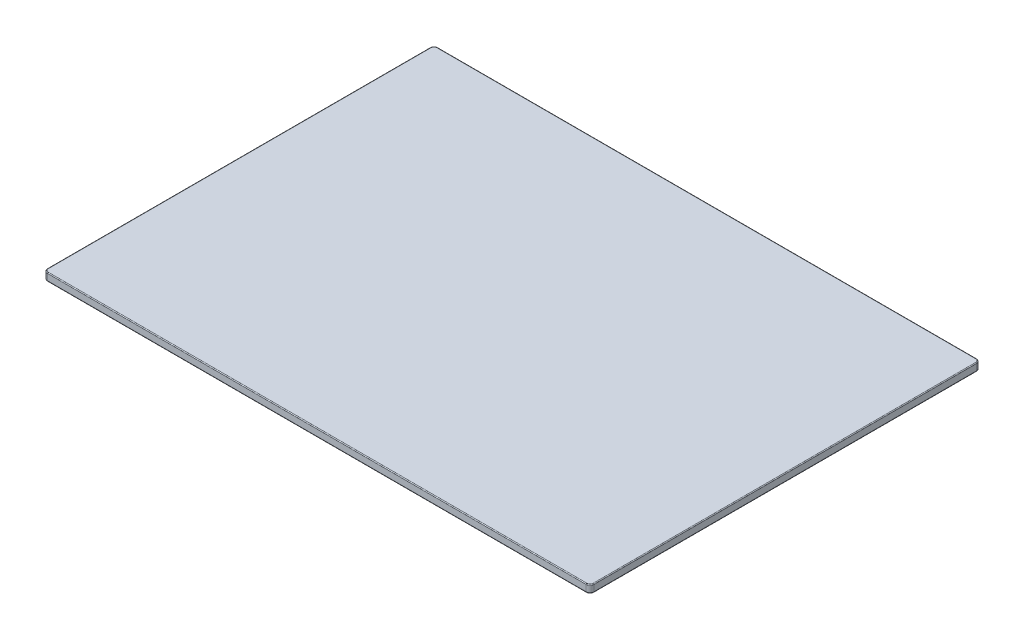
ISO-10303-21;
HEADER;
FILE_DESCRIPTION(('STEP AP214'),'2;1');
FILE_NAME('part.step','',(''),(''),'','','');
FILE_SCHEMA(('AUTOMOTIVE_DESIGN { 1 0 10303 214 1 1 1 1 }'));
ENDSEC;
DATA;
#1=APPLICATION_CONTEXT('core data for automotive mechanical design processes');
#2=APPLICATION_PROTOCOL_DEFINITION('international standard','automotive_design',2000,#1);
#3=PRODUCT_CONTEXT('',#1,'mechanical');
#4=PRODUCT('Part','Part','',(#3));
#5=PRODUCT_RELATED_PRODUCT_CATEGORY('part','',(#4));
#6=PRODUCT_DEFINITION_FORMATION('','',#4);
#7=PRODUCT_DEFINITION_CONTEXT('part definition',#1,'design');
#8=PRODUCT_DEFINITION('design','',#6,#7);
#9=PRODUCT_DEFINITION_SHAPE('','',#8);
#10=(LENGTH_UNIT() NAMED_UNIT(*) SI_UNIT(.MILLI.,.METRE.));
#11=(NAMED_UNIT(*) PLANE_ANGLE_UNIT() SI_UNIT($,.RADIAN.));
#12=(NAMED_UNIT(*) SI_UNIT($,.STERADIAN.) SOLID_ANGLE_UNIT());
#13=UNCERTAINTY_MEASURE_WITH_UNIT(LENGTH_MEASURE(1.E-05),#10,'distance_accuracy_value','');
#14=(GEOMETRIC_REPRESENTATION_CONTEXT(3) GLOBAL_UNCERTAINTY_ASSIGNED_CONTEXT((#13)) GLOBAL_UNIT_ASSIGNED_CONTEXT((#10,
#11,#12)) REPRESENTATION_CONTEXT('',''));
#15=CARTESIAN_POINT('',(0.,0.,0.));
#16=DIRECTION('',(0.,0.,1.));
#17=DIRECTION('',(1.,0.,0.));
#18=AXIS2_PLACEMENT_3D('',#15,#16,#17);
#19=CARTESIAN_POINT('',(350.,10.,250.));
#20=DIRECTION('',(-1.,0.,0.));
#21=DIRECTION('',(0.,0.,1.));
#22=AXIS2_PLACEMENT_3D('',#19,#20,#21);
#23=PLANE('',#22);
#24=DIRECTION('',(0.,-1.,0.));
#25=VECTOR('',#24,1.);
#26=CARTESIAN_POINT('',(350.,10.,245.));
#27=LINE('',#26,#25);
#28=CARTESIAN_POINT('',(350.,9.,245.));
#29=VERTEX_POINT('',#28);
#30=CARTESIAN_POINT('',(350.,0.999999999999999,245.));
#31=VERTEX_POINT('',#30);
#32=EDGE_CURVE('E299',#29,#31,#27,.T.);
#33=ORIENTED_EDGE('',*,*,#32,.T.);
#34=DIRECTION('',(0.,0.,-1.));
#35=VECTOR('',#34,1.);
#36=CARTESIAN_POINT('',(350.,0.999999999999999,-245.));
#37=LINE('',#36,#35);
#38=CARTESIAN_POINT('',(350.,0.999999999999999,-245.));
#39=VERTEX_POINT('',#38);
#40=EDGE_CURVE('E198',#31,#39,#37,.T.);
#41=ORIENTED_EDGE('',*,*,#40,.T.);
#42=DIRECTION('',(0.,-1.,0.));
#43=VECTOR('',#42,1.);
#44=CARTESIAN_POINT('',(350.,10.,-245.));
#45=LINE('',#44,#43);
#46=CARTESIAN_POINT('',(350.,9.,-245.));
#47=VERTEX_POINT('',#46);
#48=EDGE_CURVE('E302',#39,#47,#45,.F.);
#49=ORIENTED_EDGE('',*,*,#48,.T.);
#50=DIRECTION('',(0.,0.,-1.));
#51=VECTOR('',#50,1.);
#52=CARTESIAN_POINT('',(350.,9.,250.));
#53=LINE('',#52,#51);
#54=EDGE_CURVE('E196',#47,#29,#53,.F.);
#55=ORIENTED_EDGE('',*,*,#54,.T.);
#56=EDGE_LOOP('',(#33,#41,#49,#55));
#57=FACE_BOUND('',#56,.T.);
#58=ADVANCED_FACE('F41',(#57),#23,.F.);
#59=CARTESIAN_POINT('',(-350.,10.,-250.));
#60=DIRECTION('',(0.,0.,1.));
#61=DIRECTION('',(1.,0.,0.));
#62=AXIS2_PLACEMENT_3D('',#59,#60,#61);
#63=PLANE('',#62);
#64=DIRECTION('',(0.,-1.,0.));
#65=VECTOR('',#64,1.);
#66=CARTESIAN_POINT('',(345.,10.,-250.));
#67=LINE('',#66,#65);
#68=CARTESIAN_POINT('',(345.,9.,-250.));
#69=VERTEX_POINT('',#68);
#70=CARTESIAN_POINT('',(345.,0.999999999999999,-250.));
#71=VERTEX_POINT('',#70);
#72=EDGE_CURVE('E291',#69,#71,#67,.T.);
#73=ORIENTED_EDGE('',*,*,#72,.T.);
#74=DIRECTION('',(-1.,0.,0.));
#75=VECTOR('',#74,1.);
#76=CARTESIAN_POINT('',(-345.,0.999999999999999,-250.));
#77=LINE('',#76,#75);
#78=CARTESIAN_POINT('',(-345.,0.999999999999999,-250.));
#79=VERTEX_POINT('',#78);
#80=EDGE_CURVE('E207',#71,#79,#77,.T.);
#81=ORIENTED_EDGE('',*,*,#80,.T.);
#82=DIRECTION('',(0.,-1.,0.));
#83=VECTOR('',#82,1.);
#84=CARTESIAN_POINT('',(-345.,10.,-250.));
#85=LINE('',#84,#83);
#86=CARTESIAN_POINT('',(-345.,9.,-250.));
#87=VERTEX_POINT('',#86);
#88=EDGE_CURVE('E296',#79,#87,#85,.F.);
#89=ORIENTED_EDGE('',*,*,#88,.T.);
#90=DIRECTION('',(-1.,0.,0.));
#91=VECTOR('',#90,1.);
#92=CARTESIAN_POINT('',(-350.,9.,-250.));
#93=LINE('',#92,#91);
#94=EDGE_CURVE('E205',#87,#69,#93,.F.);
#95=ORIENTED_EDGE('',*,*,#94,.T.);
#96=EDGE_LOOP('',(#73,#81,#89,#95));
#97=FACE_BOUND('',#96,.T.);
#98=ADVANCED_FACE('F354',(#97),#63,.F.);
#99=CARTESIAN_POINT('',(-350.,10.,250.));
#100=DIRECTION('',(1.,0.,0.));
#101=DIRECTION('',(0.,0.,-1.));
#102=AXIS2_PLACEMENT_3D('',#99,#100,#101);
#103=PLANE('',#102);
#104=DIRECTION('',(0.,-1.,0.));
#105=VECTOR('',#104,1.);
#106=CARTESIAN_POINT('',(-350.,10.,-245.));
#107=LINE('',#106,#105);
#108=CARTESIAN_POINT('',(-350.,9.,-245.));
#109=VERTEX_POINT('',#108);
#110=CARTESIAN_POINT('',(-350.,0.999999999999999,-245.));
#111=VERTEX_POINT('',#110);
#112=EDGE_CURVE('E289',#109,#111,#107,.T.);
#113=ORIENTED_EDGE('',*,*,#112,.T.);
#114=DIRECTION('',(0.,0.,1.));
#115=VECTOR('',#114,1.);
#116=CARTESIAN_POINT('',(-350.,0.999999999999999,245.));
#117=LINE('',#116,#115);
#118=CARTESIAN_POINT('',(-350.,0.999999999999999,245.));
#119=VERTEX_POINT('',#118);
#120=EDGE_CURVE('E215',#111,#119,#117,.T.);
#121=ORIENTED_EDGE('',*,*,#120,.T.);
#122=DIRECTION('',(0.,-1.,0.));
#123=VECTOR('',#122,1.);
#124=CARTESIAN_POINT('',(-350.,10.,245.));
#125=LINE('',#124,#123);
#126=CARTESIAN_POINT('',(-350.,9.,245.));
#127=VERTEX_POINT('',#126);
#128=EDGE_CURVE('E246',#119,#127,#125,.F.);
#129=ORIENTED_EDGE('',*,*,#128,.T.);
#130=DIRECTION('',(0.,0.,1.));
#131=VECTOR('',#130,1.);
#132=CARTESIAN_POINT('',(-350.,9.,250.));
#133=LINE('',#132,#131);
#134=EDGE_CURVE('E213',#127,#109,#133,.F.);
#135=ORIENTED_EDGE('',*,*,#134,.T.);
#136=EDGE_LOOP('',(#113,#121,#129,#135));
#137=FACE_BOUND('',#136,.T.);
#138=ADVANCED_FACE('F287',(#137),#103,.F.);
#139=CARTESIAN_POINT('',(-350.,10.,250.));
#140=DIRECTION('',(0.,0.,-1.));
#141=DIRECTION('',(-1.,0.,0.));
#142=AXIS2_PLACEMENT_3D('',#139,#140,#141);
#143=PLANE('',#142);
#144=DIRECTION('',(0.,-1.,0.));
#145=VECTOR('',#144,1.);
#146=CARTESIAN_POINT('',(-345.,10.,250.));
#147=LINE('',#146,#145);
#148=CARTESIAN_POINT('',(-345.,9.,250.));
#149=VERTEX_POINT('',#148);
#150=CARTESIAN_POINT('',(-345.,0.999999999999999,250.));
#151=VERTEX_POINT('',#150);
#152=EDGE_CURVE('E284',#149,#151,#147,.T.);
#153=ORIENTED_EDGE('',*,*,#152,.T.);
#154=DIRECTION('',(1.,0.,0.));
#155=VECTOR('',#154,1.);
#156=CARTESIAN_POINT('',(345.,0.999999999999999,250.));
#157=LINE('',#156,#155);
#158=CARTESIAN_POINT('',(345.,0.999999999999999,250.));
#159=VERTEX_POINT('',#158);
#160=EDGE_CURVE('E190',#151,#159,#157,.T.);
#161=ORIENTED_EDGE('',*,*,#160,.T.);
#162=DIRECTION('',(0.,-1.,0.));
#163=VECTOR('',#162,1.);
#164=CARTESIAN_POINT('',(345.,10.,250.));
#165=LINE('',#164,#163);
#166=CARTESIAN_POINT('',(345.,9.,250.));
#167=VERTEX_POINT('',#166);
#168=EDGE_CURVE('E174',#159,#167,#165,.F.);
#169=ORIENTED_EDGE('',*,*,#168,.T.);
#170=DIRECTION('',(1.,0.,0.));
#171=VECTOR('',#170,1.);
#172=CARTESIAN_POINT('',(-350.,9.,250.));
#173=LINE('',#172,#171);
#174=EDGE_CURVE('E188',#167,#149,#173,.F.);
#175=ORIENTED_EDGE('',*,*,#174,.T.);
#176=EDGE_LOOP('',(#153,#161,#169,#175));
#177=FACE_BOUND('',#176,.T.);
#178=ADVANCED_FACE('F326',(#177),#143,.F.);
#179=CARTESIAN_POINT('',(0.,10.,0.));
#180=DIRECTION('',(0.,-1.,0.));
#181=DIRECTION('',(0.,0.,-1.));
#182=AXIS2_PLACEMENT_3D('',#179,#180,#181);
#183=PLANE('',#182);
#184=DIRECTION('',(0.,0.,-1.));
#185=VECTOR('',#184,1.);
#186=CARTESIAN_POINT('',(349.,10.,0.));
#187=LINE('',#186,#185);
#188=CARTESIAN_POINT('',(349.,10.,245.));
#189=VERTEX_POINT('',#188);
#190=CARTESIAN_POINT('',(349.,10.,-245.));
#191=VERTEX_POINT('',#190);
#192=EDGE_CURVE('E50',#189,#191,#187,.T.);
#193=ORIENTED_EDGE('',*,*,#192,.T.);
#194=CARTESIAN_POINT('',(345.,10.,-245.));
#195=DIRECTION('',(0.,-1.,0.));
#196=DIRECTION('',(0.,0.,-1.));
#197=AXIS2_PLACEMENT_3D('',#194,#195,#196);
#198=CIRCLE('',#197,4.);
#199=CARTESIAN_POINT('',(345.,10.,-249.));
#200=VERTEX_POINT('',#199);
#201=EDGE_CURVE('E11',#191,#200,#198,.F.);
#202=ORIENTED_EDGE('',*,*,#201,.T.);
#203=DIRECTION('',(-1.,0.,0.));
#204=VECTOR('',#203,1.);
#205=CARTESIAN_POINT('',(0.,10.,-249.));
#206=LINE('',#205,#204);
#207=CARTESIAN_POINT('',(-345.,10.,-249.));
#208=VERTEX_POINT('',#207);
#209=EDGE_CURVE('E217',#200,#208,#206,.T.);
#210=ORIENTED_EDGE('',*,*,#209,.T.);
#211=CARTESIAN_POINT('',(-345.,10.,-245.));
#212=DIRECTION('',(0.,-1.,0.));
#213=DIRECTION('',(0.,0.,-1.));
#214=AXIS2_PLACEMENT_3D('',#211,#212,#213);
#215=CIRCLE('',#214,4.);
#216=CARTESIAN_POINT('',(-349.,10.,-245.));
#217=VERTEX_POINT('',#216);
#218=EDGE_CURVE('E219',#208,#217,#215,.F.);
#219=ORIENTED_EDGE('',*,*,#218,.T.);
#220=DIRECTION('',(0.,0.,1.));
#221=VECTOR('',#220,1.);
#222=CARTESIAN_POINT('',(-349.,10.,0.));
#223=LINE('',#222,#221);
#224=CARTESIAN_POINT('',(-349.,10.,245.));
#225=VERTEX_POINT('',#224);
#226=EDGE_CURVE('E221',#217,#225,#223,.T.);
#227=ORIENTED_EDGE('',*,*,#226,.T.);
#228=CARTESIAN_POINT('',(-345.,10.,245.));
#229=DIRECTION('',(0.,-1.,0.));
#230=DIRECTION('',(0.,0.,-1.));
#231=AXIS2_PLACEMENT_3D('',#228,#229,#230);
#232=CIRCLE('',#231,4.);
#233=CARTESIAN_POINT('',(-345.,10.,249.));
#234=VERTEX_POINT('',#233);
#235=EDGE_CURVE('E223',#225,#234,#232,.F.);
#236=ORIENTED_EDGE('',*,*,#235,.T.);
#237=DIRECTION('',(1.,0.,0.));
#238=VECTOR('',#237,1.);
#239=CARTESIAN_POINT('',(0.,10.,249.));
#240=LINE('',#239,#238);
#241=CARTESIAN_POINT('',(345.,10.,249.));
#242=VERTEX_POINT('',#241);
#243=EDGE_CURVE('E225',#234,#242,#240,.T.);
#244=ORIENTED_EDGE('',*,*,#243,.T.);
#245=CARTESIAN_POINT('',(345.,10.,245.));
#246=DIRECTION('',(0.,-1.,0.));
#247=DIRECTION('',(0.,0.,-1.));
#248=AXIS2_PLACEMENT_3D('',#245,#246,#247);
#249=CIRCLE('',#248,4.);
#250=EDGE_CURVE('E61',#242,#189,#249,.F.);
#251=ORIENTED_EDGE('',*,*,#250,.T.);
#252=EDGE_LOOP('',(#193,#202,#210,#219,#227,#236,#244,#251));
#253=FACE_BOUND('',#252,.T.);
#254=ADVANCED_FACE('F342',(#253),#183,.F.);
#255=CARTESIAN_POINT('',(0.,0.,0.));
#256=DIRECTION('',(0.,-1.,0.));
#257=DIRECTION('',(0.,0.,-1.));
#258=AXIS2_PLACEMENT_3D('',#255,#256,#257);
#259=PLANE('',#258);
#260=DIRECTION('',(1.,0.,0.));
#261=VECTOR('',#260,1.);
#262=CARTESIAN_POINT('',(-345.,0.,249.));
#263=LINE('',#262,#261);
#264=CARTESIAN_POINT('',(345.,0.,249.));
#265=VERTEX_POINT('',#264);
#266=CARTESIAN_POINT('',(-345.,0.,249.));
#267=VERTEX_POINT('',#266);
#268=EDGE_CURVE('E178',#265,#267,#263,.F.);
#269=ORIENTED_EDGE('',*,*,#268,.T.);
#270=CARTESIAN_POINT('',(-345.,0.,245.));
#271=DIRECTION('',(0.,-1.,0.));
#272=DIRECTION('',(0.,0.,-1.));
#273=AXIS2_PLACEMENT_3D('',#270,#271,#272);
#274=CIRCLE('',#273,4.);
#275=CARTESIAN_POINT('',(-349.,0.,245.));
#276=VERTEX_POINT('',#275);
#277=EDGE_CURVE('E159',#267,#276,#274,.T.);
#278=ORIENTED_EDGE('',*,*,#277,.T.);
#279=DIRECTION('',(0.,0.,1.));
#280=VECTOR('',#279,1.);
#281=CARTESIAN_POINT('',(-349.,0.,-245.));
#282=LINE('',#281,#280);
#283=CARTESIAN_POINT('',(-349.,0.,-245.));
#284=VERTEX_POINT('',#283);
#285=EDGE_CURVE('E167',#276,#284,#282,.F.);
#286=ORIENTED_EDGE('',*,*,#285,.T.);
#287=CARTESIAN_POINT('',(-345.,0.,-245.));
#288=DIRECTION('',(0.,-1.,0.));
#289=DIRECTION('',(0.,0.,-1.));
#290=AXIS2_PLACEMENT_3D('',#287,#288,#289);
#291=CIRCLE('',#290,4.);
#292=CARTESIAN_POINT('',(-345.,0.,-249.));
#293=VERTEX_POINT('',#292);
#294=EDGE_CURVE('E173',#284,#293,#291,.T.);
#295=ORIENTED_EDGE('',*,*,#294,.T.);
#296=DIRECTION('',(-1.,0.,0.));
#297=VECTOR('',#296,1.);
#298=CARTESIAN_POINT('',(345.,0.,-249.));
#299=LINE('',#298,#297);
#300=CARTESIAN_POINT('',(345.,0.,-249.));
#301=VERTEX_POINT('',#300);
#302=EDGE_CURVE('E309',#293,#301,#299,.F.);
#303=ORIENTED_EDGE('',*,*,#302,.T.);
#304=CARTESIAN_POINT('',(345.,0.,-245.));
#305=DIRECTION('',(0.,-1.,0.));
#306=DIRECTION('',(0.,0.,-1.));
#307=AXIS2_PLACEMENT_3D('',#304,#305,#306);
#308=CIRCLE('',#307,4.);
#309=CARTESIAN_POINT('',(349.,0.,-245.));
#310=VERTEX_POINT('',#309);
#311=EDGE_CURVE('E311',#301,#310,#308,.T.);
#312=ORIENTED_EDGE('',*,*,#311,.T.);
#313=DIRECTION('',(0.,0.,-1.));
#314=VECTOR('',#313,1.);
#315=CARTESIAN_POINT('',(349.,0.,245.));
#316=LINE('',#315,#314);
#317=CARTESIAN_POINT('',(349.,0.,245.));
#318=VERTEX_POINT('',#317);
#319=EDGE_CURVE('E313',#310,#318,#316,.F.);
#320=ORIENTED_EDGE('',*,*,#319,.T.);
#321=CARTESIAN_POINT('',(345.,0.,245.));
#322=DIRECTION('',(0.,-1.,0.));
#323=DIRECTION('',(0.,0.,-1.));
#324=AXIS2_PLACEMENT_3D('',#321,#322,#323);
#325=CIRCLE('',#324,4.);
#326=EDGE_CURVE('E183',#318,#265,#325,.T.);
#327=ORIENTED_EDGE('',*,*,#326,.T.);
#328=EDGE_LOOP('',(#269,#278,#286,#295,#303,#312,#320,#327));
#329=FACE_BOUND('',#328,.T.);
#330=ADVANCED_FACE('F176',(#329),#259,.T.);
#331=CARTESIAN_POINT('',(-345.,10.,-245.));
#332=DIRECTION('',(0.,-1.,0.));
#333=DIRECTION('',(0.,0.,-1.));
#334=AXIS2_PLACEMENT_3D('',#331,#332,#333);
#335=CYLINDRICAL_SURFACE('',#334,5.);
#336=ORIENTED_EDGE('',*,*,#88,.F.);
#337=CARTESIAN_POINT('',(-345.,0.999999999999999,-245.));
#338=DIRECTION('',(0.,-1.,0.));
#339=DIRECTION('',(0.,0.,-1.));
#340=AXIS2_PLACEMENT_3D('',#337,#338,#339);
#341=CIRCLE('',#340,5.);
#342=EDGE_CURVE('E211',#79,#111,#341,.F.);
#343=ORIENTED_EDGE('',*,*,#342,.T.);
#344=ORIENTED_EDGE('',*,*,#112,.F.);
#345=CARTESIAN_POINT('',(-345.,9.,-245.));
#346=DIRECTION('',(0.,-1.,0.));
#347=DIRECTION('',(0.,0.,-1.));
#348=AXIS2_PLACEMENT_3D('',#345,#346,#347);
#349=CIRCLE('',#348,5.);
#350=EDGE_CURVE('E209',#109,#87,#349,.T.);
#351=ORIENTED_EDGE('',*,*,#350,.T.);
#352=EDGE_LOOP('',(#336,#343,#344,#351));
#353=FACE_BOUND('',#352,.T.);
#354=ADVANCED_FACE('F378',(#353),#335,.T.);
#355=CARTESIAN_POINT('',(345.,10.,-245.));
#356=DIRECTION('',(0.,-1.,0.));
#357=DIRECTION('',(0.,0.,-1.));
#358=AXIS2_PLACEMENT_3D('',#355,#356,#357);
#359=CYLINDRICAL_SURFACE('',#358,5.);
#360=ORIENTED_EDGE('',*,*,#48,.F.);
#361=CARTESIAN_POINT('',(345.,0.999999999999999,-245.));
#362=DIRECTION('',(0.,-1.,0.));
#363=DIRECTION('',(0.,0.,-1.));
#364=AXIS2_PLACEMENT_3D('',#361,#362,#363);
#365=CIRCLE('',#364,5.);
#366=EDGE_CURVE('E203',#39,#71,#365,.F.);
#367=ORIENTED_EDGE('',*,*,#366,.T.);
#368=ORIENTED_EDGE('',*,*,#72,.F.);
#369=CARTESIAN_POINT('',(345.,9.,-245.));
#370=DIRECTION('',(0.,-1.,0.));
#371=DIRECTION('',(0.,0.,-1.));
#372=AXIS2_PLACEMENT_3D('',#369,#370,#371);
#373=CIRCLE('',#372,5.);
#374=EDGE_CURVE('E200',#69,#47,#373,.T.);
#375=ORIENTED_EDGE('',*,*,#374,.T.);
#376=EDGE_LOOP('',(#360,#367,#368,#375));
#377=FACE_BOUND('',#376,.T.);
#378=ADVANCED_FACE('F359',(#377),#359,.T.);
#379=CARTESIAN_POINT('',(345.,10.,245.));
#380=DIRECTION('',(0.,-1.,0.));
#381=DIRECTION('',(0.,0.,-1.));
#382=AXIS2_PLACEMENT_3D('',#379,#380,#381);
#383=CYLINDRICAL_SURFACE('',#382,5.);
#384=ORIENTED_EDGE('',*,*,#168,.F.);
#385=CARTESIAN_POINT('',(345.,0.999999999999999,245.));
#386=DIRECTION('',(0.,-1.,0.));
#387=DIRECTION('',(0.,0.,-1.));
#388=AXIS2_PLACEMENT_3D('',#385,#386,#387);
#389=CIRCLE('',#388,5.);
#390=EDGE_CURVE('E194',#159,#31,#389,.F.);
#391=ORIENTED_EDGE('',*,*,#390,.T.);
#392=ORIENTED_EDGE('',*,*,#32,.F.);
#393=CARTESIAN_POINT('',(345.,9.,245.));
#394=DIRECTION('',(0.,-1.,0.));
#395=DIRECTION('',(0.,0.,-1.));
#396=AXIS2_PLACEMENT_3D('',#393,#394,#395);
#397=CIRCLE('',#396,5.);
#398=EDGE_CURVE('E192',#29,#167,#397,.T.);
#399=ORIENTED_EDGE('',*,*,#398,.T.);
#400=EDGE_LOOP('',(#384,#391,#392,#399));
#401=FACE_BOUND('',#400,.T.);
#402=ADVANCED_FACE('F328',(#401),#383,.T.);
#403=CARTESIAN_POINT('',(-345.,10.,245.));
#404=DIRECTION('',(0.,-1.,0.));
#405=DIRECTION('',(0.,0.,-1.));
#406=AXIS2_PLACEMENT_3D('',#403,#404,#405);
#407=CYLINDRICAL_SURFACE('',#406,5.);
#408=ORIENTED_EDGE('',*,*,#128,.F.);
#409=CARTESIAN_POINT('',(-345.,0.999999999999999,245.));
#410=DIRECTION('',(0.,-1.,0.));
#411=DIRECTION('',(0.,0.,-1.));
#412=AXIS2_PLACEMENT_3D('',#409,#410,#411);
#413=CIRCLE('',#412,5.);
#414=EDGE_CURVE('E161',#119,#151,#413,.F.);
#415=ORIENTED_EDGE('',*,*,#414,.T.);
#416=ORIENTED_EDGE('',*,*,#152,.F.);
#417=CARTESIAN_POINT('',(-345.,9.,245.));
#418=DIRECTION('',(0.,-1.,0.));
#419=DIRECTION('',(0.,0.,-1.));
#420=AXIS2_PLACEMENT_3D('',#417,#418,#419);
#421=CIRCLE('',#420,5.);
#422=EDGE_CURVE('E180',#149,#127,#421,.T.);
#423=ORIENTED_EDGE('',*,*,#422,.T.);
#424=EDGE_LOOP('',(#408,#415,#416,#423));
#425=FACE_BOUND('',#424,.T.);
#426=ADVANCED_FACE('F282',(#425),#407,.T.);
#427=CARTESIAN_POINT('',(345.,0.999999999999999,-245.));
#428=DIRECTION('',(0.,-1.,0.));
#429=DIRECTION('',(0.,0.,-1.));
#430=AXIS2_PLACEMENT_3D('',#427,#428,#429);
#431=TOROIDAL_SURFACE('',#430,4.,1.);
#432=CARTESIAN_POINT('',(345.,0.999999999999999,-249.));
#433=DIRECTION('',(-1.,0.,0.));
#434=DIRECTION('',(0.,0.,1.));
#435=AXIS2_PLACEMENT_3D('',#432,#433,#434);
#436=CIRCLE('',#435,1.);
#437=EDGE_CURVE('E240',#71,#301,#436,.T.);
#438=ORIENTED_EDGE('',*,*,#437,.F.);
#439=ORIENTED_EDGE('',*,*,#366,.F.);
#440=CARTESIAN_POINT('',(349.,1.,-245.));
#441=DIRECTION('',(0.,0.,1.));
#442=DIRECTION('',(1.,0.,0.));
#443=AXIS2_PLACEMENT_3D('',#440,#441,#442);
#444=CIRCLE('',#443,1.);
#445=EDGE_CURVE('E243',#310,#39,#444,.T.);
#446=ORIENTED_EDGE('',*,*,#445,.F.);
#447=ORIENTED_EDGE('',*,*,#311,.F.);
#448=EDGE_LOOP('',(#438,#439,#446,#447));
#449=FACE_BOUND('',#448,.T.);
#450=ADVANCED_FACE('F363',(#449),#431,.T.);
#451=CARTESIAN_POINT('',(349.,0.999999999999999,250.));
#452=DIRECTION('',(0.,0.,1.));
#453=DIRECTION('',(1.,0.,0.));
#454=AXIS2_PLACEMENT_3D('',#451,#452,#453);
#455=CYLINDRICAL_SURFACE('',#454,1.);
#456=ORIENTED_EDGE('',*,*,#445,.T.);
#457=ORIENTED_EDGE('',*,*,#40,.F.);
#458=CARTESIAN_POINT('',(349.,1.,245.));
#459=DIRECTION('',(0.,0.,1.));
#460=DIRECTION('',(1.,0.,0.));
#461=AXIS2_PLACEMENT_3D('',#458,#459,#460);
#462=CIRCLE('',#461,1.);
#463=EDGE_CURVE('E237',#318,#31,#462,.T.);
#464=ORIENTED_EDGE('',*,*,#463,.F.);
#465=ORIENTED_EDGE('',*,*,#319,.F.);
#466=EDGE_LOOP('',(#456,#457,#464,#465));
#467=FACE_BOUND('',#466,.T.);
#468=ADVANCED_FACE('F368',(#467),#455,.T.);
#469=CARTESIAN_POINT('',(-350.,0.999999999999999,-249.));
#470=DIRECTION('',(1.,0.,0.));
#471=DIRECTION('',(0.,0.,-1.));
#472=AXIS2_PLACEMENT_3D('',#469,#470,#471);
#473=CYLINDRICAL_SURFACE('',#472,1.);
#474=ORIENTED_EDGE('',*,*,#437,.T.);
#475=ORIENTED_EDGE('',*,*,#302,.F.);
#476=CARTESIAN_POINT('',(-345.,0.999999999999999,-249.));
#477=DIRECTION('',(-1.,0.,0.));
#478=DIRECTION('',(0.,0.,1.));
#479=AXIS2_PLACEMENT_3D('',#476,#477,#478);
#480=CIRCLE('',#479,1.);
#481=EDGE_CURVE('E234',#79,#293,#480,.T.);
#482=ORIENTED_EDGE('',*,*,#481,.F.);
#483=ORIENTED_EDGE('',*,*,#80,.F.);
#484=EDGE_LOOP('',(#474,#475,#482,#483));
#485=FACE_BOUND('',#484,.T.);
#486=ADVANCED_FACE('F400',(#485),#473,.T.);
#487=CARTESIAN_POINT('',(345.,0.999999999999999,245.));
#488=DIRECTION('',(0.,-1.,0.));
#489=DIRECTION('',(0.,0.,-1.));
#490=AXIS2_PLACEMENT_3D('',#487,#488,#489);
#491=TOROIDAL_SURFACE('',#490,4.,1.);
#492=ORIENTED_EDGE('',*,*,#463,.T.);
#493=ORIENTED_EDGE('',*,*,#390,.F.);
#494=CARTESIAN_POINT('',(345.,1.,249.));
#495=DIRECTION('',(-1.,0.,0.));
#496=DIRECTION('',(0.,0.,1.));
#497=AXIS2_PLACEMENT_3D('',#494,#495,#496);
#498=CIRCLE('',#497,1.);
#499=EDGE_CURVE('E231',#265,#159,#498,.T.);
#500=ORIENTED_EDGE('',*,*,#499,.F.);
#501=ORIENTED_EDGE('',*,*,#326,.F.);
#502=EDGE_LOOP('',(#492,#493,#500,#501));
#503=FACE_BOUND('',#502,.T.);
#504=ADVANCED_FACE('F320',(#503),#491,.T.);
#505=CARTESIAN_POINT('',(-345.,0.999999999999999,-245.));
#506=DIRECTION('',(0.,-1.,0.));
#507=DIRECTION('',(0.,0.,-1.));
#508=AXIS2_PLACEMENT_3D('',#505,#506,#507);
#509=TOROIDAL_SURFACE('',#508,4.,1.);
#510=ORIENTED_EDGE('',*,*,#481,.T.);
#511=ORIENTED_EDGE('',*,*,#294,.F.);
#512=CARTESIAN_POINT('',(-349.,0.999999999999999,-245.));
#513=DIRECTION('',(0.,0.,1.));
#514=DIRECTION('',(1.,0.,0.));
#515=AXIS2_PLACEMENT_3D('',#512,#513,#514);
#516=CIRCLE('',#515,1.);
#517=EDGE_CURVE('E170',#111,#284,#516,.T.);
#518=ORIENTED_EDGE('',*,*,#517,.F.);
#519=ORIENTED_EDGE('',*,*,#342,.F.);
#520=EDGE_LOOP('',(#510,#511,#518,#519));
#521=FACE_BOUND('',#520,.T.);
#522=ADVANCED_FACE('F394',(#521),#509,.T.);
#523=CARTESIAN_POINT('',(-350.,0.999999999999999,249.));
#524=DIRECTION('',(-1.,0.,0.));
#525=DIRECTION('',(0.,0.,1.));
#526=AXIS2_PLACEMENT_3D('',#523,#524,#525);
#527=CYLINDRICAL_SURFACE('',#526,1.);
#528=ORIENTED_EDGE('',*,*,#499,.T.);
#529=ORIENTED_EDGE('',*,*,#160,.F.);
#530=CARTESIAN_POINT('',(-345.,1.,249.));
#531=DIRECTION('',(-1.,0.,0.));
#532=DIRECTION('',(0.,0.,1.));
#533=AXIS2_PLACEMENT_3D('',#530,#531,#532);
#534=CIRCLE('',#533,1.);
#535=EDGE_CURVE('E164',#267,#151,#534,.T.);
#536=ORIENTED_EDGE('',*,*,#535,.F.);
#537=ORIENTED_EDGE('',*,*,#268,.F.);
#538=EDGE_LOOP('',(#528,#529,#536,#537));
#539=FACE_BOUND('',#538,.T.);
#540=ADVANCED_FACE('F323',(#539),#527,.T.);
#541=CARTESIAN_POINT('',(-349.,0.999999999999999,250.));
#542=DIRECTION('',(0.,0.,-1.));
#543=DIRECTION('',(-1.,0.,0.));
#544=AXIS2_PLACEMENT_3D('',#541,#542,#543);
#545=CYLINDRICAL_SURFACE('',#544,1.);
#546=ORIENTED_EDGE('',*,*,#517,.T.);
#547=ORIENTED_EDGE('',*,*,#285,.F.);
#548=CARTESIAN_POINT('',(-349.,0.999999999999999,245.));
#549=DIRECTION('',(0.,0.,1.));
#550=DIRECTION('',(1.,0.,0.));
#551=AXIS2_PLACEMENT_3D('',#548,#549,#550);
#552=CIRCLE('',#551,1.);
#553=EDGE_CURVE('E155',#119,#276,#552,.T.);
#554=ORIENTED_EDGE('',*,*,#553,.F.);
#555=ORIENTED_EDGE('',*,*,#120,.F.);
#556=EDGE_LOOP('',(#546,#547,#554,#555));
#557=FACE_BOUND('',#556,.T.);
#558=ADVANCED_FACE('F168',(#557),#545,.T.);
#559=CARTESIAN_POINT('',(-345.,0.999999999999999,245.));
#560=DIRECTION('',(0.,-1.,0.));
#561=DIRECTION('',(0.,0.,-1.));
#562=AXIS2_PLACEMENT_3D('',#559,#560,#561);
#563=TOROIDAL_SURFACE('',#562,4.,1.);
#564=ORIENTED_EDGE('',*,*,#535,.T.);
#565=ORIENTED_EDGE('',*,*,#414,.F.);
#566=ORIENTED_EDGE('',*,*,#553,.T.);
#567=ORIENTED_EDGE('',*,*,#277,.F.);
#568=EDGE_LOOP('',(#564,#565,#566,#567));
#569=FACE_BOUND('',#568,.T.);
#570=ADVANCED_FACE('F157',(#569),#563,.T.);
#571=CARTESIAN_POINT('',(-345.,9.,245.));
#572=DIRECTION('',(0.,-1.,0.));
#573=DIRECTION('',(0.,0.,-1.));
#574=AXIS2_PLACEMENT_3D('',#571,#572,#573);
#575=TOROIDAL_SURFACE('',#574,4.,1.);
#576=CARTESIAN_POINT('',(-349.,9.,245.));
#577=DIRECTION('',(0.,0.,-1.));
#578=DIRECTION('',(-1.,0.,0.));
#579=AXIS2_PLACEMENT_3D('',#576,#577,#578);
#580=CIRCLE('',#579,1.);
#581=EDGE_CURVE('E262',#127,#225,#580,.T.);
#582=ORIENTED_EDGE('',*,*,#581,.F.);
#583=ORIENTED_EDGE('',*,*,#422,.F.);
#584=CARTESIAN_POINT('',(-345.,9.,249.));
#585=DIRECTION('',(1.,0.,0.));
#586=DIRECTION('',(0.,0.,-1.));
#587=AXIS2_PLACEMENT_3D('',#584,#585,#586);
#588=CIRCLE('',#587,1.);
#589=EDGE_CURVE('E45',#234,#149,#588,.T.);
#590=ORIENTED_EDGE('',*,*,#589,.F.);
#591=ORIENTED_EDGE('',*,*,#235,.F.);
#592=EDGE_LOOP('',(#582,#583,#590,#591));
#593=FACE_BOUND('',#592,.T.);
#594=ADVANCED_FACE('F43',(#593),#575,.T.);
#595=CARTESIAN_POINT('',(0.,9.,249.));
#596=DIRECTION('',(1.,0.,0.));
#597=DIRECTION('',(0.,0.,-1.));
#598=AXIS2_PLACEMENT_3D('',#595,#596,#597);
#599=CYLINDRICAL_SURFACE('',#598,1.);
#600=ORIENTED_EDGE('',*,*,#589,.T.);
#601=ORIENTED_EDGE('',*,*,#174,.F.);
#602=CARTESIAN_POINT('',(345.,9.,249.));
#603=DIRECTION('',(1.,0.,0.));
#604=DIRECTION('',(0.,0.,-1.));
#605=AXIS2_PLACEMENT_3D('',#602,#603,#604);
#606=CIRCLE('',#605,1.);
#607=EDGE_CURVE('E260',#242,#167,#606,.T.);
#608=ORIENTED_EDGE('',*,*,#607,.F.);
#609=ORIENTED_EDGE('',*,*,#243,.F.);
#610=EDGE_LOOP('',(#600,#601,#608,#609));
#611=FACE_BOUND('',#610,.T.);
#612=ADVANCED_FACE('F273',(#611),#599,.T.);
#613=CARTESIAN_POINT('',(-349.,9.,0.));
#614=DIRECTION('',(0.,0.,1.));
#615=DIRECTION('',(1.,0.,0.));
#616=AXIS2_PLACEMENT_3D('',#613,#614,#615);
#617=CYLINDRICAL_SURFACE('',#616,1.);
#618=ORIENTED_EDGE('',*,*,#581,.T.);
#619=ORIENTED_EDGE('',*,*,#226,.F.);
#620=CARTESIAN_POINT('',(-349.,9.,-245.));
#621=DIRECTION('',(0.,0.,-1.));
#622=DIRECTION('',(-1.,0.,0.));
#623=AXIS2_PLACEMENT_3D('',#620,#621,#622);
#624=CIRCLE('',#623,1.);
#625=EDGE_CURVE('E257',#109,#217,#624,.T.);
#626=ORIENTED_EDGE('',*,*,#625,.F.);
#627=ORIENTED_EDGE('',*,*,#134,.F.);
#628=EDGE_LOOP('',(#618,#619,#626,#627));
#629=FACE_BOUND('',#628,.T.);
#630=ADVANCED_FACE('F418',(#629),#617,.T.);
#631=CARTESIAN_POINT('',(345.,9.,245.));
#632=DIRECTION('',(0.,-1.,0.));
#633=DIRECTION('',(0.,0.,-1.));
#634=AXIS2_PLACEMENT_3D('',#631,#632,#633);
#635=TOROIDAL_SURFACE('',#634,4.,1.);
#636=ORIENTED_EDGE('',*,*,#607,.T.);
#637=ORIENTED_EDGE('',*,*,#398,.F.);
#638=CARTESIAN_POINT('',(349.,9.,245.));
#639=DIRECTION('',(0.,0.,-1.));
#640=DIRECTION('',(-1.,0.,0.));
#641=AXIS2_PLACEMENT_3D('',#638,#639,#640);
#642=CIRCLE('',#641,1.);
#643=EDGE_CURVE('E254',#189,#29,#642,.T.);
#644=ORIENTED_EDGE('',*,*,#643,.F.);
#645=ORIENTED_EDGE('',*,*,#250,.F.);
#646=EDGE_LOOP('',(#636,#637,#644,#645));
#647=FACE_BOUND('',#646,.T.);
#648=ADVANCED_FACE('F332',(#647),#635,.T.);
#649=CARTESIAN_POINT('',(-345.,9.,-245.));
#650=DIRECTION('',(0.,-1.,0.));
#651=DIRECTION('',(0.,0.,-1.));
#652=AXIS2_PLACEMENT_3D('',#649,#650,#651);
#653=TOROIDAL_SURFACE('',#652,4.,1.);
#654=ORIENTED_EDGE('',*,*,#625,.T.);
#655=ORIENTED_EDGE('',*,*,#218,.F.);
#656=CARTESIAN_POINT('',(-345.,9.,-249.));
#657=DIRECTION('',(1.,0.,0.));
#658=DIRECTION('',(0.,0.,-1.));
#659=AXIS2_PLACEMENT_3D('',#656,#657,#658);
#660=CIRCLE('',#659,1.);
#661=EDGE_CURVE('E251',#87,#208,#660,.T.);
#662=ORIENTED_EDGE('',*,*,#661,.F.);
#663=ORIENTED_EDGE('',*,*,#350,.F.);
#664=EDGE_LOOP('',(#654,#655,#662,#663));
#665=FACE_BOUND('',#664,.T.);
#666=ADVANCED_FACE('F347',(#665),#653,.T.);
#667=CARTESIAN_POINT('',(349.,9.,0.));
#668=DIRECTION('',(0.,0.,-1.));
#669=DIRECTION('',(-1.,0.,0.));
#670=AXIS2_PLACEMENT_3D('',#667,#668,#669);
#671=CYLINDRICAL_SURFACE('',#670,1.);
#672=ORIENTED_EDGE('',*,*,#643,.T.);
#673=ORIENTED_EDGE('',*,*,#54,.F.);
#674=CARTESIAN_POINT('',(349.,9.,-245.));
#675=DIRECTION('',(0.,0.,-1.));
#676=DIRECTION('',(-1.,0.,0.));
#677=AXIS2_PLACEMENT_3D('',#674,#675,#676);
#678=CIRCLE('',#677,1.);
#679=EDGE_CURVE('E249',#191,#47,#678,.T.);
#680=ORIENTED_EDGE('',*,*,#679,.F.);
#681=ORIENTED_EDGE('',*,*,#192,.F.);
#682=EDGE_LOOP('',(#672,#673,#680,#681));
#683=FACE_BOUND('',#682,.T.);
#684=ADVANCED_FACE('F335',(#683),#671,.T.);
#685=CARTESIAN_POINT('',(0.,9.,-249.));
#686=DIRECTION('',(-1.,0.,0.));
#687=DIRECTION('',(0.,0.,1.));
#688=AXIS2_PLACEMENT_3D('',#685,#686,#687);
#689=CYLINDRICAL_SURFACE('',#688,1.);
#690=ORIENTED_EDGE('',*,*,#661,.T.);
#691=ORIENTED_EDGE('',*,*,#209,.F.);
#692=CARTESIAN_POINT('',(345.,9.,-249.));
#693=DIRECTION('',(1.,0.,0.));
#694=DIRECTION('',(0.,0.,-1.));
#695=AXIS2_PLACEMENT_3D('',#692,#693,#694);
#696=CIRCLE('',#695,1.);
#697=EDGE_CURVE('E247',#69,#200,#696,.T.);
#698=ORIENTED_EDGE('',*,*,#697,.F.);
#699=ORIENTED_EDGE('',*,*,#94,.F.);
#700=EDGE_LOOP('',(#690,#691,#698,#699));
#701=FACE_BOUND('',#700,.T.);
#702=ADVANCED_FACE('F351',(#701),#689,.T.);
#703=CARTESIAN_POINT('',(345.,9.,-245.));
#704=DIRECTION('',(0.,-1.,0.));
#705=DIRECTION('',(0.,0.,-1.));
#706=AXIS2_PLACEMENT_3D('',#703,#704,#705);
#707=TOROIDAL_SURFACE('',#706,4.,1.);
#708=ORIENTED_EDGE('',*,*,#679,.T.);
#709=ORIENTED_EDGE('',*,*,#374,.F.);
#710=ORIENTED_EDGE('',*,*,#697,.T.);
#711=ORIENTED_EDGE('',*,*,#201,.F.);
#712=EDGE_LOOP('',(#708,#709,#710,#711));
#713=FACE_BOUND('',#712,.T.);
#714=ADVANCED_FACE('F339',(#713),#707,.T.);
#715=CLOSED_SHELL('',(#58,#98,#138,#178,#254,#330,#354,#378,#402,#426,#450,#468,#486,#504,#522,
#540,#558,#570,#594,#612,#630,#648,#666,#684,#702,#714));
#716=MANIFOLD_SOLID_BREP('B2',#715);
#717=ADVANCED_BREP_SHAPE_REPRESENTATION('',(#18,#716),#14);
#718=SHAPE_DEFINITION_REPRESENTATION(#9,#717);
ENDSEC;
END-ISO-10303-21;
